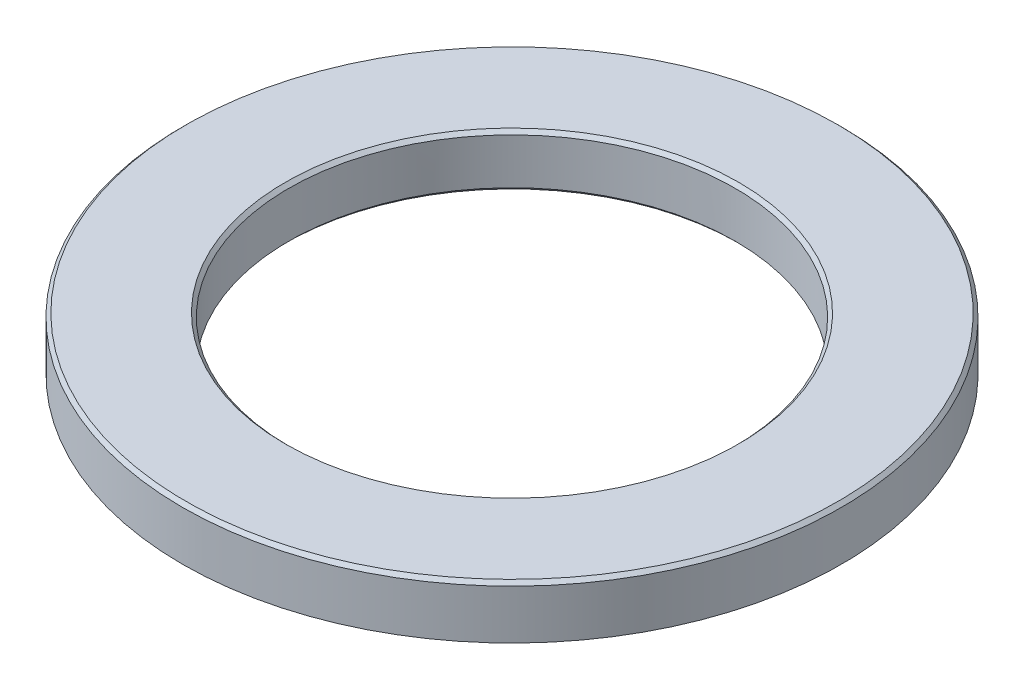
ISO-10303-21;
HEADER;
FILE_DESCRIPTION(('STEP AP214'),'2;1');
FILE_NAME('part.step','',(''),(''),'','','');
FILE_SCHEMA(('AUTOMOTIVE_DESIGN { 1 0 10303 214 1 1 1 1 }'));
ENDSEC;
DATA;
#1=APPLICATION_CONTEXT('core data for automotive mechanical design processes');
#2=APPLICATION_PROTOCOL_DEFINITION('international standard','automotive_design',2000,#1);
#3=PRODUCT_CONTEXT('',#1,'mechanical');
#4=PRODUCT('Part','Part','',(#3));
#5=PRODUCT_RELATED_PRODUCT_CATEGORY('part','',(#4));
#6=PRODUCT_DEFINITION_FORMATION('','',#4);
#7=PRODUCT_DEFINITION_CONTEXT('part definition',#1,'design');
#8=PRODUCT_DEFINITION('design','',#6,#7);
#9=PRODUCT_DEFINITION_SHAPE('','',#8);
#10=(LENGTH_UNIT() NAMED_UNIT(*) SI_UNIT(.MILLI.,.METRE.));
#11=(NAMED_UNIT(*) PLANE_ANGLE_UNIT() SI_UNIT($,.RADIAN.));
#12=(NAMED_UNIT(*) SI_UNIT($,.STERADIAN.) SOLID_ANGLE_UNIT());
#13=UNCERTAINTY_MEASURE_WITH_UNIT(LENGTH_MEASURE(1.E-05),#10,'distance_accuracy_value','');
#14=(GEOMETRIC_REPRESENTATION_CONTEXT(3) GLOBAL_UNCERTAINTY_ASSIGNED_CONTEXT((#13)) GLOBAL_UNIT_ASSIGNED_CONTEXT((#10,
#11,#12)) REPRESENTATION_CONTEXT('',''));
#15=CARTESIAN_POINT('',(0.,0.,0.));
#16=DIRECTION('',(0.,0.,1.));
#17=DIRECTION('',(1.,0.,0.));
#18=AXIS2_PLACEMENT_3D('',#15,#16,#17);
#19=CARTESIAN_POINT('',(-1.397,-0.0507999999967979,0.));
#20=DIRECTION('',(0.,1.,0.));
#21=DIRECTION('',(0.,0.,1.));
#22=AXIS2_PLACEMENT_3D('',#19,#20,#21);
#23=CONICAL_SURFACE('',#22,6.55159999996613,0.785398163397448);
#24=CARTESIAN_POINT('',(-1.397,-0.150800000000008,0.));
#25=DIRECTION('',(0.,1.,0.));
#26=DIRECTION('',(0.,0.,1.));
#27=AXIS2_PLACEMENT_3D('',#24,#25,#26);
#28=CIRCLE('',#27,6.4516);
#29=CARTESIAN_POINT('',(-1.397,-0.150800000000008,6.4516));
#30=VERTEX_POINT('',#29);
#31=EDGE_CURVE('E29',#30,#30,#28,.F.);
#32=ORIENTED_EDGE('',*,*,#31,.T.);
#33=EDGE_LOOP('',(#32));
#34=FACE_BOUND('',#33,.T.);
#35=CARTESIAN_POINT('',(-1.397,-0.0507999999967979,0.));
#36=DIRECTION('',(0.,1.,0.));
#37=DIRECTION('',(0.,0.,1.));
#38=AXIS2_PLACEMENT_3D('',#35,#36,#37);
#39=CIRCLE('',#38,6.55159999996613);
#40=CARTESIAN_POINT('',(-1.397,-0.0507999999967979,6.55159999996613));
#41=VERTEX_POINT('',#40);
#42=EDGE_CURVE('E17',#41,#41,#39,.F.);
#43=ORIENTED_EDGE('',*,*,#42,.F.);
#44=EDGE_LOOP('',(#43));
#45=FACE_BOUND('',#44,.T.);
#46=ADVANCED_FACE('F14',(#34,#45),#23,.F.);
#47=CARTESIAN_POINT('',(5.0546,-0.0507999999999997,0.));
#48=DIRECTION('',(0.,1.,0.));
#49=DIRECTION('',(0.,0.,1.));
#50=AXIS2_PLACEMENT_3D('',#47,#48,#49);
#51=PLANE('',#50);
#52=CARTESIAN_POINT('',(-1.397,-0.0507999999999998,0.));
#53=DIRECTION('',(0.,-1.,0.));
#54=DIRECTION('',(0.,0.,-1.));
#55=AXIS2_PLACEMENT_3D('',#52,#53,#54);
#56=CIRCLE('',#55,9.425);
#57=CARTESIAN_POINT('',(-1.397,-0.0507999999999998,-9.425));
#58=VERTEX_POINT('',#57);
#59=EDGE_CURVE('E31',#58,#58,#56,.T.);
#60=ORIENTED_EDGE('',*,*,#59,.F.);
#61=EDGE_LOOP('',(#60));
#62=FACE_BOUND('',#61,.T.);
#63=ORIENTED_EDGE('',*,*,#42,.T.);
#64=EDGE_LOOP('',(#63));
#65=FACE_BOUND('',#64,.T.);
#66=ADVANCED_FACE('F43',(#62,#65),#51,.T.);
#67=CARTESIAN_POINT('',(-1.397,-1.5748,0.));
#68=DIRECTION('',(0.,1.,0.));
#69=DIRECTION('',(0.,0.,1.));
#70=AXIS2_PLACEMENT_3D('',#67,#68,#69);
#71=CYLINDRICAL_SURFACE('',#70,6.4516);
#72=CARTESIAN_POINT('',(-1.397,-1.47480000003952,0.));
#73=DIRECTION('',(0.,-1.,0.));
#74=DIRECTION('',(0.,0.,-1.));
#75=AXIS2_PLACEMENT_3D('',#72,#73,#74);
#76=CIRCLE('',#75,6.45160000004807);
#77=CARTESIAN_POINT('',(-1.397,-1.47480000003952,-6.45160000004807));
#78=VERTEX_POINT('',#77);
#79=EDGE_CURVE('E33',#78,#78,#76,.T.);
#80=ORIENTED_EDGE('',*,*,#79,.T.);
#81=EDGE_LOOP('',(#80));
#82=FACE_BOUND('',#81,.T.);
#83=ORIENTED_EDGE('',*,*,#31,.F.);
#84=EDGE_LOOP('',(#83));
#85=FACE_BOUND('',#84,.T.);
#86=ADVANCED_FACE('F50',(#82,#85),#71,.F.);
#87=CARTESIAN_POINT('',(-1.397,-0.150799999999999,0.));
#88=DIRECTION('',(0.,-1.,0.));
#89=DIRECTION('',(0.,0.,-1.));
#90=AXIS2_PLACEMENT_3D('',#87,#88,#89);
#91=CONICAL_SURFACE('',#90,9.525,0.785398163397456);
#92=ORIENTED_EDGE('',*,*,#59,.T.);
#93=EDGE_LOOP('',(#92));
#94=FACE_BOUND('',#93,.T.);
#95=CARTESIAN_POINT('',(-1.397,-0.150799999999999,0.));
#96=DIRECTION('',(0.,1.,0.));
#97=DIRECTION('',(0.,0.,1.));
#98=AXIS2_PLACEMENT_3D('',#95,#96,#97);
#99=CIRCLE('',#98,9.525);
#100=CARTESIAN_POINT('',(-1.397,-0.150799999999999,9.525));
#101=VERTEX_POINT('',#100);
#102=EDGE_CURVE('E26',#101,#101,#99,.F.);
#103=ORIENTED_EDGE('',*,*,#102,.F.);
#104=EDGE_LOOP('',(#103));
#105=FACE_BOUND('',#104,.T.);
#106=ADVANCED_FACE('F67',(#94,#105),#91,.T.);
#107=CARTESIAN_POINT('',(-1.397,-1.57479999995758,0.));
#108=DIRECTION('',(0.,-1.,0.));
#109=DIRECTION('',(0.,0.,-1.));
#110=AXIS2_PLACEMENT_3D('',#107,#108,#109);
#111=CONICAL_SURFACE('',#110,6.55159999996613,0.785398163397448);
#112=ORIENTED_EDGE('',*,*,#79,.F.);
#113=EDGE_LOOP('',(#112));
#114=FACE_BOUND('',#113,.T.);
#115=CARTESIAN_POINT('',(-1.397,-1.57480000001442,0.));
#116=DIRECTION('',(0.,-1.,0.));
#117=DIRECTION('',(0.,0.,-1.));
#118=AXIS2_PLACEMENT_3D('',#115,#116,#117);
#119=CIRCLE('',#118,6.55160000002297);
#120=CARTESIAN_POINT('',(-1.397,-1.57480000001442,-6.55160000002297));
#121=VERTEX_POINT('',#120);
#122=EDGE_CURVE('E21',#121,#121,#119,.F.);
#123=ORIENTED_EDGE('',*,*,#122,.F.);
#124=EDGE_LOOP('',(#123));
#125=FACE_BOUND('',#124,.T.);
#126=ADVANCED_FACE('F60',(#114,#125),#111,.F.);
#127=CARTESIAN_POINT('',(-1.397,-1.5748,0.));
#128=DIRECTION('',(0.,1.,0.));
#129=DIRECTION('',(0.,0.,1.));
#130=AXIS2_PLACEMENT_3D('',#127,#128,#129);
#131=CYLINDRICAL_SURFACE('',#130,9.525);
#132=CARTESIAN_POINT('',(-1.397,-1.5748,0.));
#133=DIRECTION('',(0.,1.,0.));
#134=DIRECTION('',(0.,0.,1.));
#135=AXIS2_PLACEMENT_3D('',#132,#133,#134);
#136=CIRCLE('',#135,9.525);
#137=CARTESIAN_POINT('',(-1.397,-1.5748,9.525));
#138=VERTEX_POINT('',#137);
#139=EDGE_CURVE('E10',#138,#138,#136,.F.);
#140=ORIENTED_EDGE('',*,*,#139,.F.);
#141=EDGE_LOOP('',(#140));
#142=FACE_BOUND('',#141,.T.);
#143=ORIENTED_EDGE('',*,*,#102,.T.);
#144=EDGE_LOOP('',(#143));
#145=FACE_BOUND('',#144,.T.);
#146=ADVANCED_FACE('F54',(#142,#145),#131,.T.);
#147=CARTESIAN_POINT('',(8.128,-1.5748,0.));
#148=DIRECTION('',(0.,-1.,0.));
#149=DIRECTION('',(0.,0.,-1.));
#150=AXIS2_PLACEMENT_3D('',#147,#148,#149);
#151=PLANE('',#150);
#152=ORIENTED_EDGE('',*,*,#139,.T.);
#153=EDGE_LOOP('',(#152));
#154=FACE_BOUND('',#153,.T.);
#155=ORIENTED_EDGE('',*,*,#122,.T.);
#156=EDGE_LOOP('',(#155));
#157=FACE_BOUND('',#156,.T.);
#158=ADVANCED_FACE('F52',(#154,#157),#151,.T.);
#159=CLOSED_SHELL('',(#46,#66,#86,#106,#126,#146,#158));
#160=MANIFOLD_SOLID_BREP('B1',#159);
#161=ADVANCED_BREP_SHAPE_REPRESENTATION('',(#18,#160),#14);
#162=SHAPE_DEFINITION_REPRESENTATION(#9,#161);
ENDSEC;
END-ISO-10303-21;
